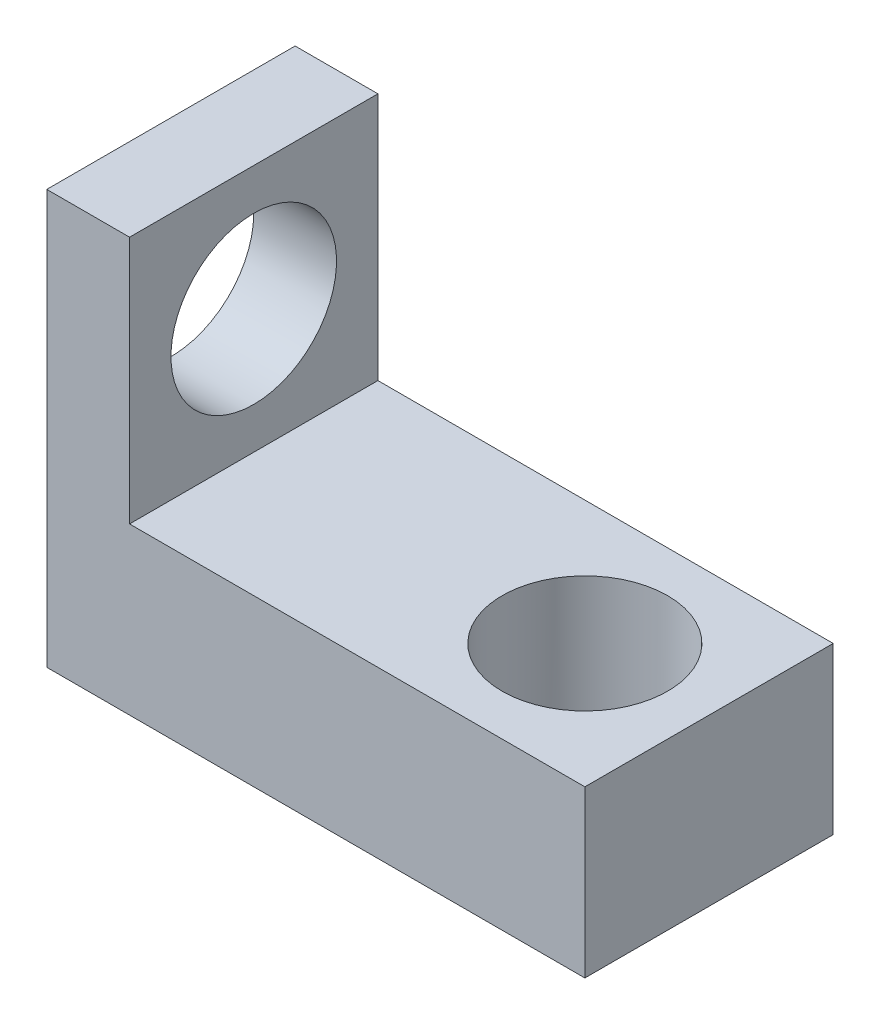
ISO-10303-21;
HEADER;
FILE_DESCRIPTION(('STEP AP214'),'2;1');
FILE_NAME('part.step','',(''),(''),'','','');
FILE_SCHEMA(('AUTOMOTIVE_DESIGN { 1 0 10303 214 1 1 1 1 }'));
ENDSEC;
DATA;
#1=APPLICATION_CONTEXT('core data for automotive mechanical design processes');
#2=APPLICATION_PROTOCOL_DEFINITION('international standard','automotive_design',2000,#1);
#3=PRODUCT_CONTEXT('',#1,'mechanical');
#4=PRODUCT('Part','Part','',(#3));
#5=PRODUCT_RELATED_PRODUCT_CATEGORY('part','',(#4));
#6=PRODUCT_DEFINITION_FORMATION('','',#4);
#7=PRODUCT_DEFINITION_CONTEXT('part definition',#1,'design');
#8=PRODUCT_DEFINITION('design','',#6,#7);
#9=PRODUCT_DEFINITION_SHAPE('','',#8);
#10=(LENGTH_UNIT() NAMED_UNIT(*) SI_UNIT(.MILLI.,.METRE.));
#11=(NAMED_UNIT(*) PLANE_ANGLE_UNIT() SI_UNIT($,.RADIAN.));
#12=(NAMED_UNIT(*) SI_UNIT($,.STERADIAN.) SOLID_ANGLE_UNIT());
#13=UNCERTAINTY_MEASURE_WITH_UNIT(LENGTH_MEASURE(1.E-05),#10,'distance_accuracy_value','');
#14=(GEOMETRIC_REPRESENTATION_CONTEXT(3) GLOBAL_UNCERTAINTY_ASSIGNED_CONTEXT((#13)) GLOBAL_UNIT_ASSIGNED_CONTEXT((#10,
#11,#12)) REPRESENTATION_CONTEXT('',''));
#15=CARTESIAN_POINT('',(0.,0.,0.));
#16=DIRECTION('',(0.,0.,1.));
#17=DIRECTION('',(1.,0.,0.));
#18=AXIS2_PLACEMENT_3D('',#15,#16,#17);
#19=CARTESIAN_POINT('',(65.,20.,-30.));
#20=DIRECTION('',(-1.,0.,0.));
#21=DIRECTION('',(0.,0.,1.));
#22=AXIS2_PLACEMENT_3D('',#19,#20,#21);
#23=PLANE('',#22);
#24=DIRECTION('',(0.,-1.,0.));
#25=VECTOR('',#24,1.);
#26=CARTESIAN_POINT('',(65.,20.,0.));
#27=LINE('',#26,#25);
#28=CARTESIAN_POINT('',(65.,20.,0.));
#29=VERTEX_POINT('',#28);
#30=CARTESIAN_POINT('',(65.,0.,0.));
#31=VERTEX_POINT('',#30);
#32=EDGE_CURVE('E138',#29,#31,#27,.T.);
#33=ORIENTED_EDGE('',*,*,#32,.T.);
#34=DIRECTION('',(0.,0.,1.));
#35=VECTOR('',#34,1.);
#36=CARTESIAN_POINT('',(65.,0.,-30.));
#37=LINE('',#36,#35);
#38=CARTESIAN_POINT('',(65.,0.,-30.));
#39=VERTEX_POINT('',#38);
#40=EDGE_CURVE('E11',#39,#31,#37,.T.);
#41=ORIENTED_EDGE('',*,*,#40,.F.);
#42=DIRECTION('',(0.,-1.,0.));
#43=VECTOR('',#42,1.);
#44=CARTESIAN_POINT('',(65.,20.,-30.));
#45=LINE('',#44,#43);
#46=CARTESIAN_POINT('',(65.,20.,-30.));
#47=VERTEX_POINT('',#46);
#48=EDGE_CURVE('E155',#47,#39,#45,.T.);
#49=ORIENTED_EDGE('',*,*,#48,.F.);
#50=DIRECTION('',(0.,0.,1.));
#51=VECTOR('',#50,1.);
#52=CARTESIAN_POINT('',(65.,20.,-30.));
#53=LINE('',#52,#51);
#54=EDGE_CURVE('E134',#47,#29,#53,.T.);
#55=ORIENTED_EDGE('',*,*,#54,.T.);
#56=EDGE_LOOP('',(#33,#41,#49,#55));
#57=FACE_BOUND('',#56,.T.);
#58=ADVANCED_FACE('F49',(#57),#23,.F.);
#59=CARTESIAN_POINT('',(65.,0.,-30.));
#60=DIRECTION('',(0.,1.,0.));
#61=DIRECTION('',(-1.,0.,0.));
#62=AXIS2_PLACEMENT_3D('',#59,#60,#61);
#63=PLANE('',#62);
#64=CARTESIAN_POINT('',(50.,0.,-15.));
#65=DIRECTION('',(0.,1.,0.));
#66=DIRECTION('',(-1.,0.,0.));
#67=AXIS2_PLACEMENT_3D('',#64,#65,#66);
#68=CIRCLE('',#67,9.99999999999999);
#69=CARTESIAN_POINT('',(40.,0.,-15.));
#70=VERTEX_POINT('',#69);
#71=EDGE_CURVE('E143',#70,#70,#68,.T.);
#72=ORIENTED_EDGE('',*,*,#71,.T.);
#73=EDGE_LOOP('',(#72));
#74=FACE_BOUND('',#73,.T.);
#75=DIRECTION('',(-1.,0.,0.));
#76=VECTOR('',#75,1.);
#77=CARTESIAN_POINT('',(65.,0.,0.));
#78=LINE('',#77,#76);
#79=CARTESIAN_POINT('',(0.,0.,0.));
#80=VERTEX_POINT('',#79);
#81=EDGE_CURVE('E142',#31,#80,#78,.T.);
#82=ORIENTED_EDGE('',*,*,#81,.T.);
#83=DIRECTION('',(0.,0.,1.));
#84=VECTOR('',#83,1.);
#85=CARTESIAN_POINT('',(0.,0.,-30.));
#86=LINE('',#85,#84);
#87=CARTESIAN_POINT('',(0.,0.,-30.));
#88=VERTEX_POINT('',#87);
#89=EDGE_CURVE('E58',#88,#80,#86,.T.);
#90=ORIENTED_EDGE('',*,*,#89,.F.);
#91=DIRECTION('',(-1.,0.,0.));
#92=VECTOR('',#91,1.);
#93=CARTESIAN_POINT('',(65.,0.,-30.));
#94=LINE('',#93,#92);
#95=EDGE_CURVE('E103',#39,#88,#94,.T.);
#96=ORIENTED_EDGE('',*,*,#95,.F.);
#97=ORIENTED_EDGE('',*,*,#40,.T.);
#98=EDGE_LOOP('',(#82,#90,#96,#97));
#99=FACE_BOUND('',#98,.T.);
#100=ADVANCED_FACE('F188',(#74,#99),#63,.F.);
#101=CARTESIAN_POINT('',(0.,0.,-30.));
#102=DIRECTION('',(1.,0.,0.));
#103=DIRECTION('',(0.,0.,-1.));
#104=AXIS2_PLACEMENT_3D('',#101,#102,#103);
#105=PLANE('',#104);
#106=CARTESIAN_POINT('',(0.,35.,-15.));
#107=DIRECTION('',(1.,0.,0.));
#108=DIRECTION('',(0.,0.,-1.));
#109=AXIS2_PLACEMENT_3D('',#106,#107,#108);
#110=CIRCLE('',#109,10.);
#111=CARTESIAN_POINT('',(0.,35.,-25.));
#112=VERTEX_POINT('',#111);
#113=EDGE_CURVE('E284',#112,#112,#110,.T.);
#114=ORIENTED_EDGE('',*,*,#113,.T.);
#115=EDGE_LOOP('',(#114));
#116=FACE_BOUND('',#115,.T.);
#117=DIRECTION('',(0.,1.,0.));
#118=VECTOR('',#117,1.);
#119=CARTESIAN_POINT('',(0.,0.,0.));
#120=LINE('',#119,#118);
#121=CARTESIAN_POINT('',(0.,50.,0.));
#122=VERTEX_POINT('',#121);
#123=EDGE_CURVE('E146',#80,#122,#120,.T.);
#124=ORIENTED_EDGE('',*,*,#123,.T.);
#125=DIRECTION('',(0.,0.,1.));
#126=VECTOR('',#125,1.);
#127=CARTESIAN_POINT('',(0.,50.,-30.));
#128=LINE('',#127,#126);
#129=CARTESIAN_POINT('',(0.,50.,-30.));
#130=VERTEX_POINT('',#129);
#131=EDGE_CURVE('E127',#130,#122,#128,.T.);
#132=ORIENTED_EDGE('',*,*,#131,.F.);
#133=DIRECTION('',(0.,1.,0.));
#134=VECTOR('',#133,1.);
#135=CARTESIAN_POINT('',(0.,0.,-30.));
#136=LINE('',#135,#134);
#137=EDGE_CURVE('E116',#88,#130,#136,.T.);
#138=ORIENTED_EDGE('',*,*,#137,.F.);
#139=ORIENTED_EDGE('',*,*,#89,.T.);
#140=EDGE_LOOP('',(#124,#132,#138,#139));
#141=FACE_BOUND('',#140,.T.);
#142=ADVANCED_FACE('F165',(#116,#141),#105,.F.);
#143=CARTESIAN_POINT('',(0.,50.,-30.));
#144=DIRECTION('',(0.,-1.,0.));
#145=DIRECTION('',(0.,0.,-1.));
#146=AXIS2_PLACEMENT_3D('',#143,#144,#145);
#147=PLANE('',#146);
#148=DIRECTION('',(1.,0.,0.));
#149=VECTOR('',#148,1.);
#150=CARTESIAN_POINT('',(0.,50.,0.));
#151=LINE('',#150,#149);
#152=CARTESIAN_POINT('',(10.,50.,0.));
#153=VERTEX_POINT('',#152);
#154=EDGE_CURVE('E125',#122,#153,#151,.T.);
#155=ORIENTED_EDGE('',*,*,#154,.T.);
#156=DIRECTION('',(0.,0.,1.));
#157=VECTOR('',#156,1.);
#158=CARTESIAN_POINT('',(10.,50.,-30.));
#159=LINE('',#158,#157);
#160=CARTESIAN_POINT('',(10.,50.,-30.));
#161=VERTEX_POINT('',#160);
#162=EDGE_CURVE('E122',#161,#153,#159,.T.);
#163=ORIENTED_EDGE('',*,*,#162,.F.);
#164=DIRECTION('',(1.,0.,0.));
#165=VECTOR('',#164,1.);
#166=CARTESIAN_POINT('',(0.,50.,-30.));
#167=LINE('',#166,#165);
#168=EDGE_CURVE('E110',#130,#161,#167,.T.);
#169=ORIENTED_EDGE('',*,*,#168,.F.);
#170=ORIENTED_EDGE('',*,*,#131,.T.);
#171=EDGE_LOOP('',(#155,#163,#169,#170));
#172=FACE_BOUND('',#171,.T.);
#173=ADVANCED_FACE('F123',(#172),#147,.F.);
#174=CARTESIAN_POINT('',(10.,50.,-30.));
#175=DIRECTION('',(-1.,0.,0.));
#176=DIRECTION('',(0.,-1.,0.));
#177=AXIS2_PLACEMENT_3D('',#174,#175,#176);
#178=PLANE('',#177);
#179=CARTESIAN_POINT('',(10.,35.,-15.));
#180=DIRECTION('',(1.,0.,0.));
#181=DIRECTION('',(0.,1.,0.));
#182=AXIS2_PLACEMENT_3D('',#179,#180,#181);
#183=CIRCLE('',#182,10.);
#184=CARTESIAN_POINT('',(9.99999999999999,45.,-15.));
#185=VERTEX_POINT('',#184);
#186=EDGE_CURVE('E281',#185,#185,#183,.T.);
#187=ORIENTED_EDGE('',*,*,#186,.F.);
#188=EDGE_LOOP('',(#187));
#189=FACE_BOUND('',#188,.T.);
#190=DIRECTION('',(0.,-1.,0.));
#191=VECTOR('',#190,1.);
#192=CARTESIAN_POINT('',(10.,50.,0.));
#193=LINE('',#192,#191);
#194=CARTESIAN_POINT('',(10.,20.,0.));
#195=VERTEX_POINT('',#194);
#196=EDGE_CURVE('E89',#153,#195,#193,.T.);
#197=ORIENTED_EDGE('',*,*,#196,.T.);
#198=DIRECTION('',(0.,0.,1.));
#199=VECTOR('',#198,1.);
#200=CARTESIAN_POINT('',(10.,20.,-30.));
#201=LINE('',#200,#199);
#202=CARTESIAN_POINT('',(10.,20.,-30.));
#203=VERTEX_POINT('',#202);
#204=EDGE_CURVE('E128',#203,#195,#201,.T.);
#205=ORIENTED_EDGE('',*,*,#204,.F.);
#206=DIRECTION('',(0.,-1.,0.));
#207=VECTOR('',#206,1.);
#208=CARTESIAN_POINT('',(10.,50.,-30.));
#209=LINE('',#208,#207);
#210=EDGE_CURVE('E114',#161,#203,#209,.T.);
#211=ORIENTED_EDGE('',*,*,#210,.F.);
#212=ORIENTED_EDGE('',*,*,#162,.T.);
#213=EDGE_LOOP('',(#197,#205,#211,#212));
#214=FACE_BOUND('',#213,.T.);
#215=ADVANCED_FACE('F130',(#189,#214),#178,.F.);
#216=CARTESIAN_POINT('',(10.,20.,-30.));
#217=DIRECTION('',(0.,-1.,0.));
#218=DIRECTION('',(0.,0.,-1.));
#219=AXIS2_PLACEMENT_3D('',#216,#217,#218);
#220=PLANE('',#219);
#221=CARTESIAN_POINT('',(50.,20.,-15.));
#222=DIRECTION('',(0.,1.,0.));
#223=DIRECTION('',(0.,0.,1.));
#224=AXIS2_PLACEMENT_3D('',#221,#222,#223);
#225=CIRCLE('',#224,9.99999999999999);
#226=CARTESIAN_POINT('',(50.,20.,-5.00000000000001));
#227=VERTEX_POINT('',#226);
#228=EDGE_CURVE('E286',#227,#227,#225,.T.);
#229=ORIENTED_EDGE('',*,*,#228,.F.);
#230=EDGE_LOOP('',(#229));
#231=FACE_BOUND('',#230,.T.);
#232=DIRECTION('',(1.,0.,0.));
#233=VECTOR('',#232,1.);
#234=CARTESIAN_POINT('',(10.,20.,0.));
#235=LINE('',#234,#233);
#236=EDGE_CURVE('E95',#195,#29,#235,.T.);
#237=ORIENTED_EDGE('',*,*,#236,.T.);
#238=ORIENTED_EDGE('',*,*,#54,.F.);
#239=DIRECTION('',(1.,0.,0.));
#240=VECTOR('',#239,1.);
#241=CARTESIAN_POINT('',(10.,20.,-30.));
#242=LINE('',#241,#240);
#243=EDGE_CURVE('E66',#203,#47,#242,.T.);
#244=ORIENTED_EDGE('',*,*,#243,.F.);
#245=ORIENTED_EDGE('',*,*,#204,.T.);
#246=EDGE_LOOP('',(#237,#238,#244,#245));
#247=FACE_BOUND('',#246,.T.);
#248=ADVANCED_FACE('F172',(#231,#247),#220,.F.);
#249=CARTESIAN_POINT('',(0.,0.,-30.));
#250=DIRECTION('',(0.,0.,-1.));
#251=DIRECTION('',(-1.,0.,0.));
#252=AXIS2_PLACEMENT_3D('',#249,#250,#251);
#253=PLANE('',#252);
#254=ORIENTED_EDGE('',*,*,#48,.T.);
#255=ORIENTED_EDGE('',*,*,#95,.T.);
#256=ORIENTED_EDGE('',*,*,#137,.T.);
#257=ORIENTED_EDGE('',*,*,#168,.T.);
#258=ORIENTED_EDGE('',*,*,#210,.T.);
#259=ORIENTED_EDGE('',*,*,#243,.T.);
#260=EDGE_LOOP('',(#254,#255,#256,#257,#258,#259));
#261=FACE_BOUND('',#260,.T.);
#262=ADVANCED_FACE('F112',(#261),#253,.T.);
#263=CARTESIAN_POINT('',(0.,0.,0.));
#264=DIRECTION('',(0.,0.,-1.));
#265=DIRECTION('',(-1.,0.,0.));
#266=AXIS2_PLACEMENT_3D('',#263,#264,#265);
#267=PLANE('',#266);
#268=ORIENTED_EDGE('',*,*,#32,.F.);
#269=ORIENTED_EDGE('',*,*,#236,.F.);
#270=ORIENTED_EDGE('',*,*,#196,.F.);
#271=ORIENTED_EDGE('',*,*,#154,.F.);
#272=ORIENTED_EDGE('',*,*,#123,.F.);
#273=ORIENTED_EDGE('',*,*,#81,.F.);
#274=EDGE_LOOP('',(#268,#269,#270,#271,#272,#273));
#275=FACE_BOUND('',#274,.T.);
#276=ADVANCED_FACE('F168',(#275),#267,.F.);
#277=CARTESIAN_POINT('',(50.,-10.,-15.));
#278=DIRECTION('',(0.,1.,0.));
#279=DIRECTION('',(0.,0.,1.));
#280=AXIS2_PLACEMENT_3D('',#277,#278,#279);
#281=CYLINDRICAL_SURFACE('',#280,9.99999999999999);
#282=ORIENTED_EDGE('',*,*,#228,.T.);
#283=EDGE_LOOP('',(#282));
#284=FACE_BOUND('',#283,.T.);
#285=ORIENTED_EDGE('',*,*,#71,.F.);
#286=EDGE_LOOP('',(#285));
#287=FACE_BOUND('',#286,.T.);
#288=ADVANCED_FACE('F217',(#284,#287),#281,.F.);
#289=CARTESIAN_POINT('',(-20.,35.,-15.));
#290=DIRECTION('',(1.,0.,0.));
#291=DIRECTION('',(0.,1.,0.));
#292=AXIS2_PLACEMENT_3D('',#289,#290,#291);
#293=CYLINDRICAL_SURFACE('',#292,10.);
#294=ORIENTED_EDGE('',*,*,#186,.T.);
#295=EDGE_LOOP('',(#294));
#296=FACE_BOUND('',#295,.T.);
#297=ORIENTED_EDGE('',*,*,#113,.F.);
#298=EDGE_LOOP('',(#297));
#299=FACE_BOUND('',#298,.T.);
#300=ADVANCED_FACE('F228',(#296,#299),#293,.F.);
#301=CLOSED_SHELL('',(#58,#100,#142,#173,#215,#248,#262,#276,#288,#300));
#302=MANIFOLD_SOLID_BREP('B2',#301);
#303=ADVANCED_BREP_SHAPE_REPRESENTATION('',(#18,#302),#14);
#304=SHAPE_DEFINITION_REPRESENTATION(#9,#303);
ENDSEC;
END-ISO-10303-21;
